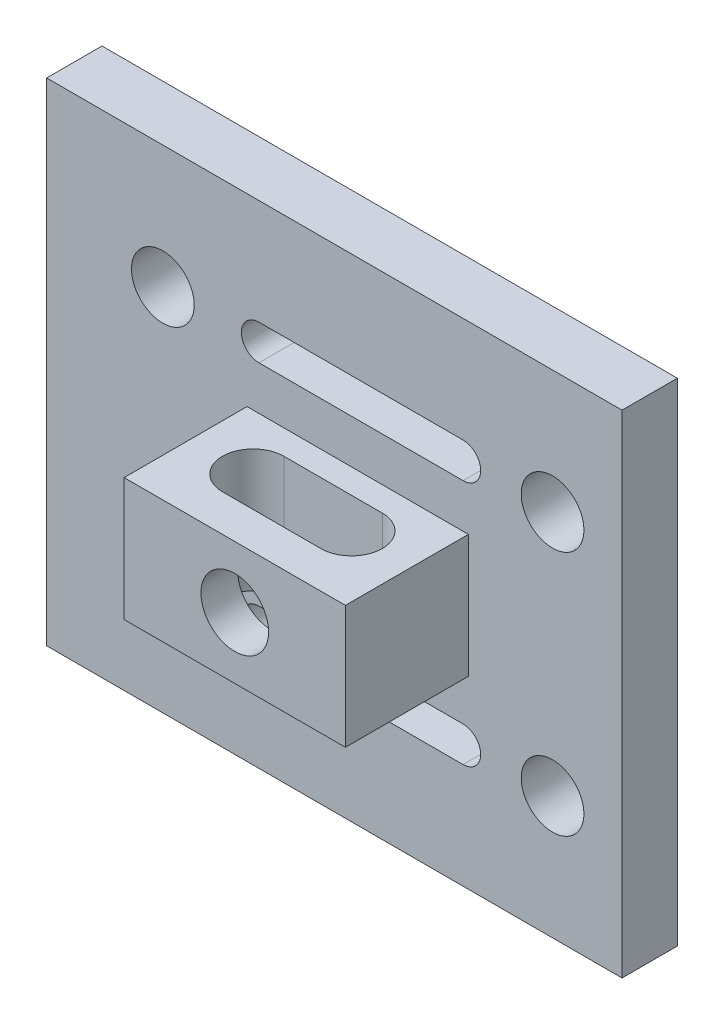
ISO-10303-21;
HEADER;
FILE_DESCRIPTION(('STEP AP214'),'2;1');
FILE_NAME('part.step','',(''),(''),'','','');
FILE_SCHEMA(('AUTOMOTIVE_DESIGN { 1 0 10303 214 1 1 1 1 }'));
ENDSEC;
DATA;
#1=APPLICATION_CONTEXT('core data for automotive mechanical design processes');
#2=APPLICATION_PROTOCOL_DEFINITION('international standard','automotive_design',2000,#1);
#3=PRODUCT_CONTEXT('',#1,'mechanical');
#4=PRODUCT('Part','Part','',(#3));
#5=PRODUCT_RELATED_PRODUCT_CATEGORY('part','',(#4));
#6=PRODUCT_DEFINITION_FORMATION('','',#4);
#7=PRODUCT_DEFINITION_CONTEXT('part definition',#1,'design');
#8=PRODUCT_DEFINITION('design','',#6,#7);
#9=PRODUCT_DEFINITION_SHAPE('','',#8);
#10=(LENGTH_UNIT() NAMED_UNIT(*) SI_UNIT(.MILLI.,.METRE.));
#11=(NAMED_UNIT(*) PLANE_ANGLE_UNIT() SI_UNIT($,.RADIAN.));
#12=(NAMED_UNIT(*) SI_UNIT($,.STERADIAN.) SOLID_ANGLE_UNIT());
#13=UNCERTAINTY_MEASURE_WITH_UNIT(LENGTH_MEASURE(1.E-05),#10,'distance_accuracy_value','');
#14=(GEOMETRIC_REPRESENTATION_CONTEXT(3) GLOBAL_UNCERTAINTY_ASSIGNED_CONTEXT((#13)) GLOBAL_UNIT_ASSIGNED_CONTEXT((#10,
#11,#12)) REPRESENTATION_CONTEXT('',''));
#15=CARTESIAN_POINT('',(0.,0.,0.));
#16=DIRECTION('',(0.,0.,1.));
#17=DIRECTION('',(1.,0.,0.));
#18=AXIS2_PLACEMENT_3D('',#15,#16,#17);
#19=CARTESIAN_POINT('',(0.,0.,4.5));
#20=DIRECTION('',(0.,0.,-1.));
#21=DIRECTION('',(-1.,0.,0.));
#22=AXIS2_PLACEMENT_3D('',#19,#20,#21);
#23=PLANE('',#22);
#24=CARTESIAN_POINT('',(8.57254150702427,20.,4.5));
#25=DIRECTION('',(0.,0.,-1.));
#26=DIRECTION('',(-1.,0.,0.));
#27=AXIS2_PLACEMENT_3D('',#24,#25,#26);
#28=CIRCLE('',#27,1.43039591315453);
#29=CARTESIAN_POINT('',(8.57254150702427,18.5696040868455,4.5));
#30=VERTEX_POINT('',#29);
#31=CARTESIAN_POINT('',(8.57254150702427,21.4303959131545,4.5));
#32=VERTEX_POINT('',#31);
#33=EDGE_CURVE('E273',#30,#32,#28,.F.);
#34=ORIENTED_EDGE('',*,*,#33,.F.);
#35=DIRECTION('',(1.,0.,0.));
#36=VECTOR('',#35,1.);
#37=CARTESIAN_POINT('',(0.,18.5696040868455,4.5));
#38=LINE('',#37,#36);
#39=CARTESIAN_POINT('',(-8.03026819923371,18.5696040868455,4.5));
#40=VERTEX_POINT('',#39);
#41=EDGE_CURVE('E260',#40,#30,#38,.T.);
#42=ORIENTED_EDGE('',*,*,#41,.F.);
#43=CARTESIAN_POINT('',(-8.03026819923371,20.,4.5));
#44=DIRECTION('',(0.,0.,-1.));
#45=DIRECTION('',(-1.,0.,0.));
#46=AXIS2_PLACEMENT_3D('',#43,#44,#45);
#47=CIRCLE('',#46,1.43039591315453);
#48=CARTESIAN_POINT('',(-8.03026819923371,21.4303959131545,4.5));
#49=VERTEX_POINT('',#48);
#50=EDGE_CURVE('E268',#49,#40,#47,.F.);
#51=ORIENTED_EDGE('',*,*,#50,.F.);
#52=DIRECTION('',(-1.,0.,0.));
#53=VECTOR('',#52,1.);
#54=CARTESIAN_POINT('',(0.,21.4303959131545,4.5));
#55=LINE('',#54,#53);
#56=EDGE_CURVE('E271',#32,#49,#55,.T.);
#57=ORIENTED_EDGE('',*,*,#56,.F.);
#58=EDGE_LOOP('',(#34,#42,#51,#57));
#59=FACE_BOUND('',#58,.T.);
#60=DIRECTION('',(1.,0.,0.));
#61=VECTOR('',#60,1.);
#62=CARTESIAN_POINT('',(0.,1.43039591315453,4.5));
#63=LINE('',#62,#61);
#64=CARTESIAN_POINT('',(-8.03026819923371,1.43039591315453,4.5));
#65=VERTEX_POINT('',#64);
#66=CARTESIAN_POINT('',(8.57254150702427,1.43039591315453,4.5));
#67=VERTEX_POINT('',#66);
#68=EDGE_CURVE('E325',#65,#67,#63,.T.);
#69=ORIENTED_EDGE('',*,*,#68,.T.);
#70=CARTESIAN_POINT('',(8.57254150702427,0.,4.5));
#71=DIRECTION('',(0.,0.,-1.));
#72=DIRECTION('',(-1.,0.,0.));
#73=AXIS2_PLACEMENT_3D('',#70,#71,#72);
#74=CIRCLE('',#73,1.43039591315453);
#75=CARTESIAN_POINT('',(8.57254150702427,-1.43039591315453,4.5));
#76=VERTEX_POINT('',#75);
#77=EDGE_CURVE('E328',#67,#76,#74,.T.);
#78=ORIENTED_EDGE('',*,*,#77,.T.);
#79=DIRECTION('',(-1.,0.,0.));
#80=VECTOR('',#79,1.);
#81=CARTESIAN_POINT('',(0.,-1.43039591315453,4.5));
#82=LINE('',#81,#80);
#83=CARTESIAN_POINT('',(-8.03026819923371,-1.43039591315453,4.5));
#84=VERTEX_POINT('',#83);
#85=EDGE_CURVE('E313',#76,#84,#82,.T.);
#86=ORIENTED_EDGE('',*,*,#85,.T.);
#87=CARTESIAN_POINT('',(-8.03026819923371,0.,4.5));
#88=DIRECTION('',(0.,0.,-1.));
#89=DIRECTION('',(-1.,0.,0.));
#90=AXIS2_PLACEMENT_3D('',#87,#88,#89);
#91=CIRCLE('',#90,1.43039591315453);
#92=EDGE_CURVE('E322',#84,#65,#91,.T.);
#93=ORIENTED_EDGE('',*,*,#92,.T.);
#94=EDGE_LOOP('',(#69,#78,#86,#93));
#95=FACE_BOUND('',#94,.T.);
#96=DIRECTION('',(0.,-1.,0.));
#97=VECTOR('',#96,1.);
#98=CARTESIAN_POINT('',(-25.3,9.99999999999999,4.5));
#99=LINE('',#98,#97);
#100=CARTESIAN_POINT('',(-25.3,30.,4.5));
#101=VERTEX_POINT('',#100);
#102=CARTESIAN_POINT('',(-25.3,-10.,4.5));
#103=VERTEX_POINT('',#102);
#104=EDGE_CURVE('E344',#101,#103,#99,.T.);
#105=ORIENTED_EDGE('',*,*,#104,.T.);
#106=DIRECTION('',(1.,0.,0.));
#107=VECTOR('',#106,1.);
#108=CARTESIAN_POINT('',(21.5,-10.,4.5));
#109=LINE('',#108,#107);
#110=CARTESIAN_POINT('',(21.5,-10.,4.5));
#111=VERTEX_POINT('',#110);
#112=EDGE_CURVE('E347',#103,#111,#109,.T.);
#113=ORIENTED_EDGE('',*,*,#112,.T.);
#114=DIRECTION('',(0.,1.,0.));
#115=VECTOR('',#114,1.);
#116=CARTESIAN_POINT('',(21.5,9.99999999999999,4.5));
#117=LINE('',#116,#115);
#118=CARTESIAN_POINT('',(21.5,30.,4.5));
#119=VERTEX_POINT('',#118);
#120=EDGE_CURVE('E350',#111,#119,#117,.T.);
#121=ORIENTED_EDGE('',*,*,#120,.T.);
#122=DIRECTION('',(1.,0.,0.));
#123=VECTOR('',#122,1.);
#124=CARTESIAN_POINT('',(21.5,30.,4.5));
#125=LINE('',#124,#123);
#126=EDGE_CURVE('E288',#101,#119,#125,.T.);
#127=ORIENTED_EDGE('',*,*,#126,.F.);
#128=EDGE_LOOP('',(#105,#113,#121,#127));
#129=FACE_BOUND('',#128,.T.);
#130=CARTESIAN_POINT('',(-15.85,0.,4.5));
#131=DIRECTION('',(0.,0.,1.));
#132=DIRECTION('',(1.,0.,0.));
#133=AXIS2_PLACEMENT_3D('',#130,#131,#132);
#134=CIRCLE('',#133,2.55);
#135=CARTESIAN_POINT('',(-13.3,0.,4.5));
#136=VERTEX_POINT('',#135);
#137=EDGE_CURVE('E338',#136,#136,#134,.T.);
#138=ORIENTED_EDGE('',*,*,#137,.F.);
#139=EDGE_LOOP('',(#138));
#140=FACE_BOUND('',#139,.T.);
#141=CARTESIAN_POINT('',(15.85,0.,4.5));
#142=DIRECTION('',(0.,0.,1.));
#143=DIRECTION('',(1.,0.,0.));
#144=AXIS2_PLACEMENT_3D('',#141,#142,#143);
#145=CIRCLE('',#144,2.55);
#146=CARTESIAN_POINT('',(18.4,0.,4.5));
#147=VERTEX_POINT('',#146);
#148=EDGE_CURVE('E332',#147,#147,#145,.T.);
#149=ORIENTED_EDGE('',*,*,#148,.F.);
#150=EDGE_LOOP('',(#149));
#151=FACE_BOUND('',#150,.T.);
#152=CARTESIAN_POINT('',(15.85,20.,4.5));
#153=DIRECTION('',(0.,0.,-1.));
#154=DIRECTION('',(1.,0.,0.));
#155=AXIS2_PLACEMENT_3D('',#152,#153,#154);
#156=CIRCLE('',#155,2.55);
#157=CARTESIAN_POINT('',(18.4,20.,4.5));
#158=VERTEX_POINT('',#157);
#159=EDGE_CURVE('E276',#158,#158,#156,.T.);
#160=ORIENTED_EDGE('',*,*,#159,.T.);
#161=EDGE_LOOP('',(#160));
#162=FACE_BOUND('',#161,.T.);
#163=CARTESIAN_POINT('',(-15.85,20.,4.5));
#164=DIRECTION('',(0.,0.,-1.));
#165=DIRECTION('',(1.,0.,0.));
#166=AXIS2_PLACEMENT_3D('',#163,#164,#165);
#167=CIRCLE('',#166,2.55);
#168=CARTESIAN_POINT('',(-13.3,20.,4.5));
#169=VERTEX_POINT('',#168);
#170=EDGE_CURVE('E282',#169,#169,#167,.T.);
#171=ORIENTED_EDGE('',*,*,#170,.T.);
#172=EDGE_LOOP('',(#171));
#173=FACE_BOUND('',#172,.T.);
#174=DIRECTION('',(0.,1.,0.));
#175=VECTOR('',#174,1.);
#176=CARTESIAN_POINT('',(9.,4.99999999999999,4.5));
#177=LINE('',#176,#175);
#178=CARTESIAN_POINT('',(9.,4.99999999999999,4.5));
#179=VERTEX_POINT('',#178);
#180=CARTESIAN_POINT('',(9.,15.,4.5));
#181=VERTEX_POINT('',#180);
#182=EDGE_CURVE('E209',#179,#181,#177,.T.);
#183=ORIENTED_EDGE('',*,*,#182,.F.);
#184=DIRECTION('',(1.,0.,0.));
#185=VECTOR('',#184,1.);
#186=CARTESIAN_POINT('',(-9.,4.99999999999999,4.5));
#187=LINE('',#186,#185);
#188=CARTESIAN_POINT('',(-9.,4.99999999999999,4.5));
#189=VERTEX_POINT('',#188);
#190=EDGE_CURVE('E217',#189,#179,#187,.T.);
#191=ORIENTED_EDGE('',*,*,#190,.F.);
#192=DIRECTION('',(0.,-1.,0.));
#193=VECTOR('',#192,1.);
#194=CARTESIAN_POINT('',(-9.,4.99999999999999,4.5));
#195=LINE('',#194,#193);
#196=CARTESIAN_POINT('',(-9.,15.,4.5));
#197=VERTEX_POINT('',#196);
#198=EDGE_CURVE('E229',#197,#189,#195,.T.);
#199=ORIENTED_EDGE('',*,*,#198,.F.);
#200=DIRECTION('',(-1.,0.,0.));
#201=VECTOR('',#200,1.);
#202=CARTESIAN_POINT('',(-9.,15.,4.5));
#203=LINE('',#202,#201);
#204=EDGE_CURVE('E226',#181,#197,#203,.T.);
#205=ORIENTED_EDGE('',*,*,#204,.F.);
#206=EDGE_LOOP('',(#183,#191,#199,#205));
#207=FACE_BOUND('',#206,.T.);
#208=ADVANCED_FACE('F35',(#59,#95,#129,#140,#151,#162,#173,#207),#23,.F.);
#209=CARTESIAN_POINT('',(0.,0.,0.));
#210=DIRECTION('',(0.,0.,-1.));
#211=DIRECTION('',(-1.,0.,0.));
#212=AXIS2_PLACEMENT_3D('',#209,#210,#211);
#213=PLANE('',#212);
#214=CARTESIAN_POINT('',(8.57254150702427,0.,0.));
#215=DIRECTION('',(0.,0.,-1.));
#216=DIRECTION('',(-1.,0.,0.));
#217=AXIS2_PLACEMENT_3D('',#214,#215,#216);
#218=CIRCLE('',#217,1.43039591315453);
#219=CARTESIAN_POINT('',(8.57254150702427,1.43039591315453,0.));
#220=VERTEX_POINT('',#219);
#221=CARTESIAN_POINT('',(8.57254150702427,-1.43039591315453,0.));
#222=VERTEX_POINT('',#221);
#223=EDGE_CURVE('E299',#220,#222,#218,.T.);
#224=ORIENTED_EDGE('',*,*,#223,.F.);
#225=DIRECTION('',(1.,0.,0.));
#226=VECTOR('',#225,1.);
#227=CARTESIAN_POINT('',(8.57254150702427,1.43039591315453,0.));
#228=LINE('',#227,#226);
#229=CARTESIAN_POINT('',(-8.03026819923371,1.43039591315453,0.));
#230=VERTEX_POINT('',#229);
#231=EDGE_CURVE('E307',#230,#220,#228,.T.);
#232=ORIENTED_EDGE('',*,*,#231,.F.);
#233=CARTESIAN_POINT('',(-8.03026819923371,0.,0.));
#234=DIRECTION('',(0.,0.,-1.));
#235=DIRECTION('',(-1.,0.,0.));
#236=AXIS2_PLACEMENT_3D('',#233,#234,#235);
#237=CIRCLE('',#236,1.43039591315453);
#238=CARTESIAN_POINT('',(-8.03026819923371,-1.43039591315453,0.));
#239=VERTEX_POINT('',#238);
#240=EDGE_CURVE('E304',#239,#230,#237,.T.);
#241=ORIENTED_EDGE('',*,*,#240,.F.);
#242=DIRECTION('',(-1.,0.,0.));
#243=VECTOR('',#242,1.);
#244=CARTESIAN_POINT('',(8.57254150702427,-1.43039591315453,0.));
#245=LINE('',#244,#243);
#246=EDGE_CURVE('E301',#222,#239,#245,.T.);
#247=ORIENTED_EDGE('',*,*,#246,.F.);
#248=EDGE_LOOP('',(#224,#232,#241,#247));
#249=FACE_BOUND('',#248,.T.);
#250=CARTESIAN_POINT('',(-15.85,0.,0.));
#251=DIRECTION('',(0.,0.,1.));
#252=DIRECTION('',(1.,0.,0.));
#253=AXIS2_PLACEMENT_3D('',#250,#251,#252);
#254=CIRCLE('',#253,2.55);
#255=CARTESIAN_POINT('',(-13.3,0.,0.));
#256=VERTEX_POINT('',#255);
#257=EDGE_CURVE('E335',#256,#256,#254,.T.);
#258=ORIENTED_EDGE('',*,*,#257,.T.);
#259=EDGE_LOOP('',(#258));
#260=FACE_BOUND('',#259,.T.);
#261=DIRECTION('',(0.,-1.,0.));
#262=VECTOR('',#261,1.);
#263=CARTESIAN_POINT('',(-25.3,9.99999999999999,0.));
#264=LINE('',#263,#262);
#265=CARTESIAN_POINT('',(-25.3,30.,0.));
#266=VERTEX_POINT('',#265);
#267=CARTESIAN_POINT('',(-25.3,-10.,0.));
#268=VERTEX_POINT('',#267);
#269=EDGE_CURVE('E341',#266,#268,#264,.T.);
#270=ORIENTED_EDGE('',*,*,#269,.F.);
#271=DIRECTION('',(1.,0.,0.));
#272=VECTOR('',#271,1.);
#273=CARTESIAN_POINT('',(21.5,30.,0.));
#274=LINE('',#273,#272);
#275=CARTESIAN_POINT('',(21.5,30.,0.));
#276=VERTEX_POINT('',#275);
#277=EDGE_CURVE('E285',#266,#276,#274,.T.);
#278=ORIENTED_EDGE('',*,*,#277,.T.);
#279=DIRECTION('',(0.,1.,0.));
#280=VECTOR('',#279,1.);
#281=CARTESIAN_POINT('',(21.5,9.99999999999999,0.));
#282=LINE('',#281,#280);
#283=CARTESIAN_POINT('',(21.5,-10.,0.));
#284=VERTEX_POINT('',#283);
#285=EDGE_CURVE('E348',#284,#276,#282,.T.);
#286=ORIENTED_EDGE('',*,*,#285,.F.);
#287=DIRECTION('',(1.,0.,0.));
#288=VECTOR('',#287,1.);
#289=CARTESIAN_POINT('',(21.5,-10.,0.));
#290=LINE('',#289,#288);
#291=EDGE_CURVE('E354',#268,#284,#290,.T.);
#292=ORIENTED_EDGE('',*,*,#291,.F.);
#293=EDGE_LOOP('',(#270,#278,#286,#292));
#294=FACE_BOUND('',#293,.T.);
#295=CARTESIAN_POINT('',(15.85,0.,0.));
#296=DIRECTION('',(0.,0.,1.));
#297=DIRECTION('',(1.,0.,0.));
#298=AXIS2_PLACEMENT_3D('',#295,#296,#297);
#299=CIRCLE('',#298,2.55);
#300=CARTESIAN_POINT('',(18.4,0.,0.));
#301=VERTEX_POINT('',#300);
#302=EDGE_CURVE('E331',#301,#301,#299,.T.);
#303=ORIENTED_EDGE('',*,*,#302,.T.);
#304=EDGE_LOOP('',(#303));
#305=FACE_BOUND('',#304,.T.);
#306=CARTESIAN_POINT('',(15.85,20.,0.));
#307=DIRECTION('',(0.,0.,-1.));
#308=DIRECTION('',(1.,0.,0.));
#309=AXIS2_PLACEMENT_3D('',#306,#307,#308);
#310=CIRCLE('',#309,2.55);
#311=CARTESIAN_POINT('',(18.4,20.,0.));
#312=VERTEX_POINT('',#311);
#313=EDGE_CURVE('E275',#312,#312,#310,.T.);
#314=ORIENTED_EDGE('',*,*,#313,.F.);
#315=EDGE_LOOP('',(#314));
#316=FACE_BOUND('',#315,.T.);
#317=CARTESIAN_POINT('',(-15.85,20.,0.));
#318=DIRECTION('',(0.,0.,-1.));
#319=DIRECTION('',(1.,0.,0.));
#320=AXIS2_PLACEMENT_3D('',#317,#318,#319);
#321=CIRCLE('',#320,2.55);
#322=CARTESIAN_POINT('',(-13.3,20.,0.));
#323=VERTEX_POINT('',#322);
#324=EDGE_CURVE('E279',#323,#323,#321,.T.);
#325=ORIENTED_EDGE('',*,*,#324,.F.);
#326=EDGE_LOOP('',(#325));
#327=FACE_BOUND('',#326,.T.);
#328=DIRECTION('',(1.,0.,0.));
#329=VECTOR('',#328,1.);
#330=CARTESIAN_POINT('',(8.57254150702427,18.5696040868455,0.));
#331=LINE('',#330,#329);
#332=CARTESIAN_POINT('',(-8.03026819923371,18.5696040868454,0.));
#333=VERTEX_POINT('',#332);
#334=CARTESIAN_POINT('',(8.57254150702427,18.5696040868455,0.));
#335=VERTEX_POINT('',#334);
#336=EDGE_CURVE('E248',#333,#335,#331,.T.);
#337=ORIENTED_EDGE('',*,*,#336,.T.);
#338=CARTESIAN_POINT('',(8.57254150702427,20.,0.));
#339=DIRECTION('',(0.,0.,1.));
#340=DIRECTION('',(-1.,0.,0.));
#341=AXIS2_PLACEMENT_3D('',#338,#339,#340);
#342=CIRCLE('',#341,1.43039591315453);
#343=CARTESIAN_POINT('',(8.57254150702427,21.4303959131545,0.));
#344=VERTEX_POINT('',#343);
#345=EDGE_CURVE('E245',#335,#344,#342,.T.);
#346=ORIENTED_EDGE('',*,*,#345,.T.);
#347=DIRECTION('',(-1.,0.,0.));
#348=VECTOR('',#347,1.);
#349=CARTESIAN_POINT('',(8.57254150702427,21.4303959131545,0.));
#350=LINE('',#349,#348);
#351=CARTESIAN_POINT('',(-8.03026819923371,21.4303959131545,0.));
#352=VERTEX_POINT('',#351);
#353=EDGE_CURVE('E254',#344,#352,#350,.T.);
#354=ORIENTED_EDGE('',*,*,#353,.T.);
#355=CARTESIAN_POINT('',(-8.03026819923371,20.,0.));
#356=DIRECTION('',(0.,0.,1.));
#357=DIRECTION('',(-1.,0.,0.));
#358=AXIS2_PLACEMENT_3D('',#355,#356,#357);
#359=CIRCLE('',#358,1.43039591315453);
#360=EDGE_CURVE('E251',#352,#333,#359,.T.);
#361=ORIENTED_EDGE('',*,*,#360,.T.);
#362=EDGE_LOOP('',(#337,#346,#354,#361));
#363=FACE_BOUND('',#362,.T.);
#364=ADVANCED_FACE('F365',(#249,#260,#294,#305,#316,#327,#363),#213,.T.);
#365=CARTESIAN_POINT('',(-25.3,9.99999999999999,4.5));
#366=DIRECTION('',(1.,0.,0.));
#367=DIRECTION('',(0.,1.,0.));
#368=AXIS2_PLACEMENT_3D('',#365,#366,#367);
#369=PLANE('',#368);
#370=ORIENTED_EDGE('',*,*,#269,.T.);
#371=DIRECTION('',(0.,0.,-1.));
#372=VECTOR('',#371,1.);
#373=CARTESIAN_POINT('',(-25.3,-10.,4.5));
#374=LINE('',#373,#372);
#375=EDGE_CURVE('E11',#103,#268,#374,.T.);
#376=ORIENTED_EDGE('',*,*,#375,.F.);
#377=ORIENTED_EDGE('',*,*,#104,.F.);
#378=DIRECTION('',(0.,0.,-1.));
#379=VECTOR('',#378,1.);
#380=CARTESIAN_POINT('',(-25.3,30.,4.5));
#381=LINE('',#380,#379);
#382=EDGE_CURVE('E291',#101,#266,#381,.T.);
#383=ORIENTED_EDGE('',*,*,#382,.T.);
#384=EDGE_LOOP('',(#370,#376,#377,#383));
#385=FACE_BOUND('',#384,.T.);
#386=ADVANCED_FACE('F37',(#385),#369,.F.);
#387=CARTESIAN_POINT('',(21.5,-10.,4.5));
#388=DIRECTION('',(0.,1.,0.));
#389=DIRECTION('',(-1.,0.,0.));
#390=AXIS2_PLACEMENT_3D('',#387,#388,#389);
#391=PLANE('',#390);
#392=ORIENTED_EDGE('',*,*,#291,.T.);
#393=DIRECTION('',(0.,0.,-1.));
#394=VECTOR('',#393,1.);
#395=CARTESIAN_POINT('',(21.5,-10.,4.5));
#396=LINE('',#395,#394);
#397=EDGE_CURVE('E43',#111,#284,#396,.T.);
#398=ORIENTED_EDGE('',*,*,#397,.F.);
#399=ORIENTED_EDGE('',*,*,#112,.F.);
#400=ORIENTED_EDGE('',*,*,#375,.T.);
#401=EDGE_LOOP('',(#392,#398,#399,#400));
#402=FACE_BOUND('',#401,.T.);
#403=ADVANCED_FACE('F375',(#402),#391,.F.);
#404=CARTESIAN_POINT('',(21.5,9.99999999999999,4.5));
#405=DIRECTION('',(-1.,0.,0.));
#406=DIRECTION('',(0.,-1.,0.));
#407=AXIS2_PLACEMENT_3D('',#404,#405,#406);
#408=PLANE('',#407);
#409=ORIENTED_EDGE('',*,*,#285,.T.);
#410=DIRECTION('',(0.,0.,-1.));
#411=VECTOR('',#410,1.);
#412=CARTESIAN_POINT('',(21.5,30.,4.5));
#413=LINE('',#412,#411);
#414=EDGE_CURVE('E296',#119,#276,#413,.T.);
#415=ORIENTED_EDGE('',*,*,#414,.F.);
#416=ORIENTED_EDGE('',*,*,#120,.F.);
#417=ORIENTED_EDGE('',*,*,#397,.T.);
#418=EDGE_LOOP('',(#409,#415,#416,#417));
#419=FACE_BOUND('',#418,.T.);
#420=ADVANCED_FACE('F361',(#419),#408,.F.);
#421=CARTESIAN_POINT('',(-15.85,0.,4.5));
#422=DIRECTION('',(0.,0.,-1.));
#423=DIRECTION('',(-1.,0.,0.));
#424=AXIS2_PLACEMENT_3D('',#421,#422,#423);
#425=CYLINDRICAL_SURFACE('',#424,2.55);
#426=ORIENTED_EDGE('',*,*,#137,.T.);
#427=EDGE_LOOP('',(#426));
#428=FACE_BOUND('',#427,.T.);
#429=ORIENTED_EDGE('',*,*,#257,.F.);
#430=EDGE_LOOP('',(#429));
#431=FACE_BOUND('',#430,.T.);
#432=ADVANCED_FACE('F394',(#428,#431),#425,.F.);
#433=CARTESIAN_POINT('',(15.85,0.,4.5));
#434=DIRECTION('',(0.,0.,-1.));
#435=DIRECTION('',(-1.,0.,0.));
#436=AXIS2_PLACEMENT_3D('',#433,#434,#435);
#437=CYLINDRICAL_SURFACE('',#436,2.55);
#438=ORIENTED_EDGE('',*,*,#148,.T.);
#439=EDGE_LOOP('',(#438));
#440=FACE_BOUND('',#439,.T.);
#441=ORIENTED_EDGE('',*,*,#302,.F.);
#442=EDGE_LOOP('',(#441));
#443=FACE_BOUND('',#442,.T.);
#444=ADVANCED_FACE('F401',(#440,#443),#437,.F.);
#445=CARTESIAN_POINT('',(8.57254150702427,0.,8.));
#446=DIRECTION('',(0.,0.,-1.));
#447=DIRECTION('',(-1.,0.,0.));
#448=AXIS2_PLACEMENT_3D('',#445,#446,#447);
#449=CYLINDRICAL_SURFACE('',#448,1.43039591315453);
#450=DIRECTION('',(0.,0.,-1.));
#451=VECTOR('',#450,1.);
#452=CARTESIAN_POINT('',(8.57254150702427,1.43039591315453,8.));
#453=LINE('',#452,#451);
#454=EDGE_CURVE('E311',#67,#220,#453,.T.);
#455=ORIENTED_EDGE('',*,*,#454,.T.);
#456=ORIENTED_EDGE('',*,*,#223,.T.);
#457=DIRECTION('',(0.,0.,-1.));
#458=VECTOR('',#457,1.);
#459=CARTESIAN_POINT('',(8.57254150702427,-1.43039591315453,8.));
#460=LINE('',#459,#458);
#461=EDGE_CURVE('E310',#76,#222,#460,.T.);
#462=ORIENTED_EDGE('',*,*,#461,.F.);
#463=ORIENTED_EDGE('',*,*,#77,.F.);
#464=EDGE_LOOP('',(#455,#456,#462,#463));
#465=FACE_BOUND('',#464,.T.);
#466=ADVANCED_FACE('F406',(#465),#449,.F.);
#467=CARTESIAN_POINT('',(8.57254150702427,1.43039591315453,8.));
#468=DIRECTION('',(0.,1.,0.));
#469=DIRECTION('',(0.,0.,1.));
#470=AXIS2_PLACEMENT_3D('',#467,#468,#469);
#471=PLANE('',#470);
#472=DIRECTION('',(0.,0.,-1.));
#473=VECTOR('',#472,1.);
#474=CARTESIAN_POINT('',(-8.03026819923371,1.43039591315453,8.));
#475=LINE('',#474,#473);
#476=EDGE_CURVE('E314',#65,#230,#475,.T.);
#477=ORIENTED_EDGE('',*,*,#476,.T.);
#478=ORIENTED_EDGE('',*,*,#231,.T.);
#479=ORIENTED_EDGE('',*,*,#454,.F.);
#480=ORIENTED_EDGE('',*,*,#68,.F.);
#481=EDGE_LOOP('',(#477,#478,#479,#480));
#482=FACE_BOUND('',#481,.T.);
#483=ADVANCED_FACE('F471',(#482),#471,.F.);
#484=CARTESIAN_POINT('',(-8.03026819923371,0.,8.));
#485=DIRECTION('',(0.,0.,-1.));
#486=DIRECTION('',(-1.,0.,0.));
#487=AXIS2_PLACEMENT_3D('',#484,#485,#486);
#488=CYLINDRICAL_SURFACE('',#487,1.43039591315453);
#489=DIRECTION('',(0.,0.,-1.));
#490=VECTOR('',#489,1.);
#491=CARTESIAN_POINT('',(-8.03026819923371,-1.43039591315453,8.));
#492=LINE('',#491,#490);
#493=EDGE_CURVE('E316',#84,#239,#492,.T.);
#494=ORIENTED_EDGE('',*,*,#493,.T.);
#495=ORIENTED_EDGE('',*,*,#240,.T.);
#496=ORIENTED_EDGE('',*,*,#476,.F.);
#497=ORIENTED_EDGE('',*,*,#92,.F.);
#498=EDGE_LOOP('',(#494,#495,#496,#497));
#499=FACE_BOUND('',#498,.T.);
#500=ADVANCED_FACE('F474',(#499),#488,.F.);
#501=CARTESIAN_POINT('',(8.57254150702427,-1.43039591315453,8.));
#502=DIRECTION('',(0.,-1.,0.));
#503=DIRECTION('',(0.,0.,-1.));
#504=AXIS2_PLACEMENT_3D('',#501,#502,#503);
#505=PLANE('',#504);
#506=ORIENTED_EDGE('',*,*,#461,.T.);
#507=ORIENTED_EDGE('',*,*,#246,.T.);
#508=ORIENTED_EDGE('',*,*,#493,.F.);
#509=ORIENTED_EDGE('',*,*,#85,.F.);
#510=EDGE_LOOP('',(#506,#507,#508,#509));
#511=FACE_BOUND('',#510,.T.);
#512=ADVANCED_FACE('F470',(#511),#505,.F.);
#513=CARTESIAN_POINT('',(21.5,30.,4.5));
#514=DIRECTION('',(0.,1.,0.));
#515=DIRECTION('',(-1.,0.,0.));
#516=AXIS2_PLACEMENT_3D('',#513,#514,#515);
#517=PLANE('',#516);
#518=ORIENTED_EDGE('',*,*,#277,.F.);
#519=ORIENTED_EDGE('',*,*,#382,.F.);
#520=ORIENTED_EDGE('',*,*,#126,.T.);
#521=ORIENTED_EDGE('',*,*,#414,.T.);
#522=EDGE_LOOP('',(#518,#519,#520,#521));
#523=FACE_BOUND('',#522,.T.);
#524=ADVANCED_FACE('F370',(#523),#517,.T.);
#525=CARTESIAN_POINT('',(-15.85,20.,4.5));
#526=DIRECTION('',(0.,0.,-1.));
#527=DIRECTION('',(-1.,0.,0.));
#528=AXIS2_PLACEMENT_3D('',#525,#526,#527);
#529=CYLINDRICAL_SURFACE('',#528,2.55);
#530=ORIENTED_EDGE('',*,*,#170,.F.);
#531=EDGE_LOOP('',(#530));
#532=FACE_BOUND('',#531,.T.);
#533=ORIENTED_EDGE('',*,*,#324,.T.);
#534=EDGE_LOOP('',(#533));
#535=FACE_BOUND('',#534,.T.);
#536=ADVANCED_FACE('F463',(#532,#535),#529,.F.);
#537=CARTESIAN_POINT('',(15.85,20.,4.5));
#538=DIRECTION('',(0.,0.,-1.));
#539=DIRECTION('',(-1.,0.,0.));
#540=AXIS2_PLACEMENT_3D('',#537,#538,#539);
#541=CYLINDRICAL_SURFACE('',#540,2.55);
#542=ORIENTED_EDGE('',*,*,#159,.F.);
#543=EDGE_LOOP('',(#542));
#544=FACE_BOUND('',#543,.T.);
#545=ORIENTED_EDGE('',*,*,#313,.T.);
#546=EDGE_LOOP('',(#545));
#547=FACE_BOUND('',#546,.T.);
#548=ADVANCED_FACE('F459',(#544,#547),#541,.F.);
#549=CARTESIAN_POINT('',(8.57254150702427,20.,8.));
#550=DIRECTION('',(0.,0.,-1.));
#551=DIRECTION('',(-1.,0.,0.));
#552=AXIS2_PLACEMENT_3D('',#549,#550,#551);
#553=CYLINDRICAL_SURFACE('',#552,1.43039591315453);
#554=ORIENTED_EDGE('',*,*,#33,.T.);
#555=DIRECTION('',(0.,0.,-1.));
#556=VECTOR('',#555,1.);
#557=CARTESIAN_POINT('',(8.57254150702427,21.4303959131545,8.));
#558=LINE('',#557,#556);
#559=EDGE_CURVE('E258',#32,#344,#558,.T.);
#560=ORIENTED_EDGE('',*,*,#559,.T.);
#561=ORIENTED_EDGE('',*,*,#345,.F.);
#562=DIRECTION('',(0.,0.,-1.));
#563=VECTOR('',#562,1.);
#564=CARTESIAN_POINT('',(8.57254150702427,18.5696040868455,8.));
#565=LINE('',#564,#563);
#566=EDGE_CURVE('E257',#30,#335,#565,.T.);
#567=ORIENTED_EDGE('',*,*,#566,.F.);
#568=EDGE_LOOP('',(#554,#560,#561,#567));
#569=FACE_BOUND('',#568,.T.);
#570=ADVANCED_FACE('F449',(#569),#553,.F.);
#571=CARTESIAN_POINT('',(8.57254150702427,21.4303959131545,8.));
#572=DIRECTION('',(0.,-1.,0.));
#573=DIRECTION('',(1.,0.,0.));
#574=AXIS2_PLACEMENT_3D('',#571,#572,#573);
#575=PLANE('',#574);
#576=ORIENTED_EDGE('',*,*,#56,.T.);
#577=DIRECTION('',(0.,0.,-1.));
#578=VECTOR('',#577,1.);
#579=CARTESIAN_POINT('',(-8.03026819923371,21.4303959131545,8.));
#580=LINE('',#579,#578);
#581=EDGE_CURVE('E261',#49,#352,#580,.T.);
#582=ORIENTED_EDGE('',*,*,#581,.T.);
#583=ORIENTED_EDGE('',*,*,#353,.F.);
#584=ORIENTED_EDGE('',*,*,#559,.F.);
#585=EDGE_LOOP('',(#576,#582,#583,#584));
#586=FACE_BOUND('',#585,.T.);
#587=ADVANCED_FACE('F445',(#586),#575,.T.);
#588=CARTESIAN_POINT('',(-8.03026819923371,20.,8.));
#589=DIRECTION('',(0.,0.,-1.));
#590=DIRECTION('',(-1.,0.,0.));
#591=AXIS2_PLACEMENT_3D('',#588,#589,#590);
#592=CYLINDRICAL_SURFACE('',#591,1.43039591315453);
#593=ORIENTED_EDGE('',*,*,#50,.T.);
#594=DIRECTION('',(0.,0.,-1.));
#595=VECTOR('',#594,1.);
#596=CARTESIAN_POINT('',(-8.03026819923371,18.5696040868454,8.));
#597=LINE('',#596,#595);
#598=EDGE_CURVE('E263',#40,#333,#597,.T.);
#599=ORIENTED_EDGE('',*,*,#598,.T.);
#600=ORIENTED_EDGE('',*,*,#360,.F.);
#601=ORIENTED_EDGE('',*,*,#581,.F.);
#602=EDGE_LOOP('',(#593,#599,#600,#601));
#603=FACE_BOUND('',#602,.T.);
#604=ADVANCED_FACE('F448',(#603),#592,.F.);
#605=CARTESIAN_POINT('',(8.57254150702427,18.5696040868455,8.));
#606=DIRECTION('',(0.,1.,0.));
#607=DIRECTION('',(-1.,0.,0.));
#608=AXIS2_PLACEMENT_3D('',#605,#606,#607);
#609=PLANE('',#608);
#610=ORIENTED_EDGE('',*,*,#41,.T.);
#611=ORIENTED_EDGE('',*,*,#566,.T.);
#612=ORIENTED_EDGE('',*,*,#336,.F.);
#613=ORIENTED_EDGE('',*,*,#598,.F.);
#614=EDGE_LOOP('',(#610,#611,#612,#613));
#615=FACE_BOUND('',#614,.T.);
#616=ADVANCED_FACE('F441',(#615),#609,.T.);
#617=CARTESIAN_POINT('',(9.,4.99999999999999,14.5));
#618=DIRECTION('',(-1.,0.,0.));
#619=DIRECTION('',(0.,0.,1.));
#620=AXIS2_PLACEMENT_3D('',#617,#618,#619);
#621=PLANE('',#620);
#622=ORIENTED_EDGE('',*,*,#182,.T.);
#623=DIRECTION('',(0.,0.,-1.));
#624=VECTOR('',#623,1.);
#625=CARTESIAN_POINT('',(9.,15.,14.5));
#626=LINE('',#625,#624);
#627=CARTESIAN_POINT('',(9.,15.,14.5));
#628=VERTEX_POINT('',#627);
#629=EDGE_CURVE('E242',#628,#181,#626,.T.);
#630=ORIENTED_EDGE('',*,*,#629,.F.);
#631=DIRECTION('',(0.,1.,0.));
#632=VECTOR('',#631,1.);
#633=CARTESIAN_POINT('',(9.,4.99999999999999,14.5));
#634=LINE('',#633,#632);
#635=CARTESIAN_POINT('',(9.,4.99999999999999,14.5));
#636=VERTEX_POINT('',#635);
#637=EDGE_CURVE('E213',#636,#628,#634,.T.);
#638=ORIENTED_EDGE('',*,*,#637,.F.);
#639=DIRECTION('',(0.,0.,-1.));
#640=VECTOR('',#639,1.);
#641=CARTESIAN_POINT('',(9.,4.99999999999999,14.5));
#642=LINE('',#641,#640);
#643=EDGE_CURVE('E223',#636,#179,#642,.T.);
#644=ORIENTED_EDGE('',*,*,#643,.T.);
#645=EDGE_LOOP('',(#622,#630,#638,#644));
#646=FACE_BOUND('',#645,.T.);
#647=ADVANCED_FACE('F427',(#646),#621,.F.);
#648=CARTESIAN_POINT('',(-9.,15.,14.5));
#649=DIRECTION('',(0.,-1.,0.));
#650=DIRECTION('',(0.,0.,-1.));
#651=AXIS2_PLACEMENT_3D('',#648,#649,#650);
#652=PLANE('',#651);
#653=DIRECTION('',(-1.,0.,0.));
#654=VECTOR('',#653,1.);
#655=CARTESIAN_POINT('',(-4.,15.,11.5));
#656=LINE('',#655,#654);
#657=CARTESIAN_POINT('',(4.,15.,11.5));
#658=VERTEX_POINT('',#657);
#659=CARTESIAN_POINT('',(-4.,15.,11.5));
#660=VERTEX_POINT('',#659);
#661=EDGE_CURVE('E180',#658,#660,#656,.T.);
#662=ORIENTED_EDGE('',*,*,#661,.T.);
#663=CARTESIAN_POINT('',(-4.,15.,9.));
#664=DIRECTION('',(0.,-1.,0.));
#665=DIRECTION('',(0.,0.,-1.));
#666=AXIS2_PLACEMENT_3D('',#663,#664,#665);
#667=CIRCLE('',#666,2.5);
#668=CARTESIAN_POINT('',(-4.,15.,6.5));
#669=VERTEX_POINT('',#668);
#670=EDGE_CURVE('E174',#660,#669,#667,.T.);
#671=ORIENTED_EDGE('',*,*,#670,.T.);
#672=DIRECTION('',(1.,0.,0.));
#673=VECTOR('',#672,1.);
#674=CARTESIAN_POINT('',(-4.,15.,6.5));
#675=LINE('',#674,#673);
#676=CARTESIAN_POINT('',(4.,15.,6.5));
#677=VERTEX_POINT('',#676);
#678=EDGE_CURVE('E183',#669,#677,#675,.T.);
#679=ORIENTED_EDGE('',*,*,#678,.T.);
#680=CARTESIAN_POINT('',(4.,15.,9.));
#681=DIRECTION('',(0.,-1.,0.));
#682=DIRECTION('',(0.,0.,-1.));
#683=AXIS2_PLACEMENT_3D('',#680,#681,#682);
#684=CIRCLE('',#683,2.5);
#685=EDGE_CURVE('E50',#677,#658,#684,.T.);
#686=ORIENTED_EDGE('',*,*,#685,.T.);
#687=EDGE_LOOP('',(#662,#671,#679,#686));
#688=FACE_BOUND('',#687,.T.);
#689=ORIENTED_EDGE('',*,*,#204,.T.);
#690=DIRECTION('',(0.,0.,-1.));
#691=VECTOR('',#690,1.);
#692=CARTESIAN_POINT('',(-9.,15.,14.5));
#693=LINE('',#692,#691);
#694=CARTESIAN_POINT('',(-9.,15.,14.5));
#695=VERTEX_POINT('',#694);
#696=EDGE_CURVE('E239',#695,#197,#693,.T.);
#697=ORIENTED_EDGE('',*,*,#696,.F.);
#698=DIRECTION('',(-1.,0.,0.));
#699=VECTOR('',#698,1.);
#700=CARTESIAN_POINT('',(-9.,15.,14.5));
#701=LINE('',#700,#699);
#702=EDGE_CURVE('E216',#628,#695,#701,.T.);
#703=ORIENTED_EDGE('',*,*,#702,.F.);
#704=ORIENTED_EDGE('',*,*,#629,.T.);
#705=EDGE_LOOP('',(#689,#697,#703,#704));
#706=FACE_BOUND('',#705,.T.);
#707=ADVANCED_FACE('F187',(#688,#706),#652,.F.);
#708=CARTESIAN_POINT('',(-9.,4.99999999999999,14.5));
#709=DIRECTION('',(1.,0.,0.));
#710=DIRECTION('',(0.,0.,-1.));
#711=AXIS2_PLACEMENT_3D('',#708,#709,#710);
#712=PLANE('',#711);
#713=ORIENTED_EDGE('',*,*,#198,.T.);
#714=DIRECTION('',(0.,0.,-1.));
#715=VECTOR('',#714,1.);
#716=CARTESIAN_POINT('',(-9.,4.99999999999999,14.5));
#717=LINE('',#716,#715);
#718=CARTESIAN_POINT('',(-9.,4.99999999999999,14.5));
#719=VERTEX_POINT('',#718);
#720=EDGE_CURVE('E236',#719,#189,#717,.T.);
#721=ORIENTED_EDGE('',*,*,#720,.F.);
#722=DIRECTION('',(0.,-1.,0.));
#723=VECTOR('',#722,1.);
#724=CARTESIAN_POINT('',(-9.,4.99999999999999,14.5));
#725=LINE('',#724,#723);
#726=EDGE_CURVE('E219',#695,#719,#725,.T.);
#727=ORIENTED_EDGE('',*,*,#726,.F.);
#728=ORIENTED_EDGE('',*,*,#696,.T.);
#729=EDGE_LOOP('',(#713,#721,#727,#728));
#730=FACE_BOUND('',#729,.T.);
#731=ADVANCED_FACE('F433',(#730),#712,.F.);
#732=CARTESIAN_POINT('',(-9.,4.99999999999999,14.5));
#733=DIRECTION('',(0.,1.,0.));
#734=DIRECTION('',(0.,0.,1.));
#735=AXIS2_PLACEMENT_3D('',#732,#733,#734);
#736=PLANE('',#735);
#737=DIRECTION('',(1.,0.,0.));
#738=VECTOR('',#737,1.);
#739=CARTESIAN_POINT('',(-4.,4.99999999999999,6.5));
#740=LINE('',#739,#738);
#741=CARTESIAN_POINT('',(-4.,4.99999999999999,6.5));
#742=VERTEX_POINT('',#741);
#743=CARTESIAN_POINT('',(4.,4.99999999999999,6.5));
#744=VERTEX_POINT('',#743);
#745=EDGE_CURVE('E202',#742,#744,#740,.T.);
#746=ORIENTED_EDGE('',*,*,#745,.F.);
#747=CARTESIAN_POINT('',(-4.,4.99999999999999,9.));
#748=DIRECTION('',(0.,-1.,0.));
#749=DIRECTION('',(0.,0.,-1.));
#750=AXIS2_PLACEMENT_3D('',#747,#748,#749);
#751=CIRCLE('',#750,2.5);
#752=CARTESIAN_POINT('',(-4.,4.99999999999999,11.5));
#753=VERTEX_POINT('',#752);
#754=EDGE_CURVE('E58',#753,#742,#751,.T.);
#755=ORIENTED_EDGE('',*,*,#754,.F.);
#756=DIRECTION('',(-1.,0.,0.));
#757=VECTOR('',#756,1.);
#758=CARTESIAN_POINT('',(-4.,4.99999999999999,11.5));
#759=LINE('',#758,#757);
#760=CARTESIAN_POINT('',(4.,4.99999999999999,11.5));
#761=VERTEX_POINT('',#760);
#762=EDGE_CURVE('E190',#761,#753,#759,.T.);
#763=ORIENTED_EDGE('',*,*,#762,.F.);
#764=CARTESIAN_POINT('',(4.,4.99999999999999,9.));
#765=DIRECTION('',(0.,-1.,0.));
#766=DIRECTION('',(0.,0.,-1.));
#767=AXIS2_PLACEMENT_3D('',#764,#765,#766);
#768=CIRCLE('',#767,2.5);
#769=EDGE_CURVE('E193',#744,#761,#768,.T.);
#770=ORIENTED_EDGE('',*,*,#769,.F.);
#771=EDGE_LOOP('',(#746,#755,#763,#770));
#772=FACE_BOUND('',#771,.T.);
#773=ORIENTED_EDGE('',*,*,#190,.T.);
#774=ORIENTED_EDGE('',*,*,#643,.F.);
#775=DIRECTION('',(1.,0.,0.));
#776=VECTOR('',#775,1.);
#777=CARTESIAN_POINT('',(-9.,4.99999999999999,14.5));
#778=LINE('',#777,#776);
#779=EDGE_CURVE('E221',#719,#636,#778,.T.);
#780=ORIENTED_EDGE('',*,*,#779,.F.);
#781=ORIENTED_EDGE('',*,*,#720,.T.);
#782=EDGE_LOOP('',(#773,#774,#780,#781));
#783=FACE_BOUND('',#782,.T.);
#784=ADVANCED_FACE('F423',(#772,#783),#736,.F.);
#785=CARTESIAN_POINT('',(0.,0.,14.5));
#786=DIRECTION('',(0.,0.,-1.));
#787=DIRECTION('',(-1.,0.,0.));
#788=AXIS2_PLACEMENT_3D('',#785,#786,#787);
#789=PLANE('',#788);
#790=CARTESIAN_POINT('',(0.,9.99999999999999,14.5));
#791=DIRECTION('',(0.,0.,1.));
#792=DIRECTION('',(1.,0.,0.));
#793=AXIS2_PLACEMENT_3D('',#790,#791,#792);
#794=CIRCLE('',#793,2.75);
#795=CARTESIAN_POINT('',(2.75,9.99999999999999,14.5));
#796=VERTEX_POINT('',#795);
#797=EDGE_CURVE('E196',#796,#796,#794,.T.);
#798=ORIENTED_EDGE('',*,*,#797,.F.);
#799=EDGE_LOOP('',(#798));
#800=FACE_BOUND('',#799,.T.);
#801=ORIENTED_EDGE('',*,*,#637,.T.);
#802=ORIENTED_EDGE('',*,*,#702,.T.);
#803=ORIENTED_EDGE('',*,*,#726,.T.);
#804=ORIENTED_EDGE('',*,*,#779,.T.);
#805=EDGE_LOOP('',(#801,#802,#803,#804));
#806=FACE_BOUND('',#805,.T.);
#807=ADVANCED_FACE('F429',(#800,#806),#789,.F.);
#808=CARTESIAN_POINT('',(-4.,15.,9.));
#809=DIRECTION('',(0.,-1.,0.));
#810=DIRECTION('',(0.,0.,-1.));
#811=AXIS2_PLACEMENT_3D('',#808,#809,#810);
#812=CYLINDRICAL_SURFACE('',#811,2.5);
#813=ORIENTED_EDGE('',*,*,#754,.T.);
#814=DIRECTION('',(0.,-1.,0.));
#815=VECTOR('',#814,1.);
#816=CARTESIAN_POINT('',(-4.,15.,6.5));
#817=LINE('',#816,#815);
#818=EDGE_CURVE('E170',#669,#742,#817,.T.);
#819=ORIENTED_EDGE('',*,*,#818,.F.);
#820=ORIENTED_EDGE('',*,*,#670,.F.);
#821=DIRECTION('',(0.,-1.,0.));
#822=VECTOR('',#821,1.);
#823=CARTESIAN_POINT('',(-4.,15.,11.5));
#824=LINE('',#823,#822);
#825=EDGE_CURVE('E207',#660,#753,#824,.T.);
#826=ORIENTED_EDGE('',*,*,#825,.T.);
#827=EDGE_LOOP('',(#813,#819,#820,#826));
#828=FACE_BOUND('',#827,.T.);
#829=ADVANCED_FACE('F172',(#828),#812,.F.);
#830=CARTESIAN_POINT('',(-4.,15.,11.5));
#831=DIRECTION('',(0.,0.,1.));
#832=DIRECTION('',(1.,0.,0.));
#833=AXIS2_PLACEMENT_3D('',#830,#831,#832);
#834=PLANE('',#833);
#835=CARTESIAN_POINT('',(0.,9.99999999999999,11.5));
#836=DIRECTION('',(0.,0.,1.));
#837=DIRECTION('',(1.,0.,0.));
#838=AXIS2_PLACEMENT_3D('',#835,#836,#837);
#839=CIRCLE('',#838,2.75);
#840=CARTESIAN_POINT('',(2.75,9.99999999999999,11.5));
#841=VERTEX_POINT('',#840);
#842=EDGE_CURVE('E203',#841,#841,#839,.T.);
#843=ORIENTED_EDGE('',*,*,#842,.T.);
#844=EDGE_LOOP('',(#843));
#845=FACE_BOUND('',#844,.T.);
#846=ORIENTED_EDGE('',*,*,#762,.T.);
#847=ORIENTED_EDGE('',*,*,#825,.F.);
#848=ORIENTED_EDGE('',*,*,#661,.F.);
#849=DIRECTION('',(0.,-1.,0.));
#850=VECTOR('',#849,1.);
#851=CARTESIAN_POINT('',(4.,15.,11.5));
#852=LINE('',#851,#850);
#853=EDGE_CURVE('E210',#658,#761,#852,.T.);
#854=ORIENTED_EDGE('',*,*,#853,.T.);
#855=EDGE_LOOP('',(#846,#847,#848,#854));
#856=FACE_BOUND('',#855,.T.);
#857=ADVANCED_FACE('F573',(#845,#856),#834,.F.);
#858=CARTESIAN_POINT('',(4.,15.,9.));
#859=DIRECTION('',(0.,-1.,0.));
#860=DIRECTION('',(0.,0.,-1.));
#861=AXIS2_PLACEMENT_3D('',#858,#859,#860);
#862=CYLINDRICAL_SURFACE('',#861,2.5);
#863=ORIENTED_EDGE('',*,*,#769,.T.);
#864=ORIENTED_EDGE('',*,*,#853,.F.);
#865=ORIENTED_EDGE('',*,*,#685,.F.);
#866=DIRECTION('',(0.,-1.,0.));
#867=VECTOR('',#866,1.);
#868=CARTESIAN_POINT('',(4.,15.,6.5));
#869=LINE('',#868,#867);
#870=EDGE_CURVE('E179',#677,#744,#869,.T.);
#871=ORIENTED_EDGE('',*,*,#870,.T.);
#872=EDGE_LOOP('',(#863,#864,#865,#871));
#873=FACE_BOUND('',#872,.T.);
#874=ADVANCED_FACE('F580',(#873),#862,.F.);
#875=CARTESIAN_POINT('',(-4.,15.,6.5));
#876=DIRECTION('',(0.,0.,-1.));
#877=DIRECTION('',(-1.,0.,0.));
#878=AXIS2_PLACEMENT_3D('',#875,#876,#877);
#879=PLANE('',#878);
#880=ORIENTED_EDGE('',*,*,#745,.T.);
#881=ORIENTED_EDGE('',*,*,#870,.F.);
#882=ORIENTED_EDGE('',*,*,#678,.F.);
#883=ORIENTED_EDGE('',*,*,#818,.T.);
#884=EDGE_LOOP('',(#880,#881,#882,#883));
#885=FACE_BOUND('',#884,.T.);
#886=ADVANCED_FACE('F184',(#885),#879,.F.);
#887=CARTESIAN_POINT('',(0.,9.99999999999999,11.5));
#888=DIRECTION('',(0.,0.,1.));
#889=DIRECTION('',(1.,0.,0.));
#890=AXIS2_PLACEMENT_3D('',#887,#888,#889);
#891=CYLINDRICAL_SURFACE('',#890,2.75);
#892=ORIENTED_EDGE('',*,*,#842,.F.);
#893=EDGE_LOOP('',(#892));
#894=FACE_BOUND('',#893,.T.);
#895=ORIENTED_EDGE('',*,*,#797,.T.);
#896=EDGE_LOOP('',(#895));
#897=FACE_BOUND('',#896,.T.);
#898=ADVANCED_FACE('F593',(#894,#897),#891,.F.);
#899=CLOSED_SHELL('',(#208,#364,#386,#403,#420,#432,#444,#466,#483,#500,#512,#524,#536,#548,
#570,#587,#604,#616,#647,#707,#731,#784,#807,#829,#857,#874,#886,#898));
#900=MANIFOLD_SOLID_BREP('B2',#899);
#901=ADVANCED_BREP_SHAPE_REPRESENTATION('',(#18,#900),#14);
#902=SHAPE_DEFINITION_REPRESENTATION(#9,#901);
ENDSEC;
END-ISO-10303-21;
